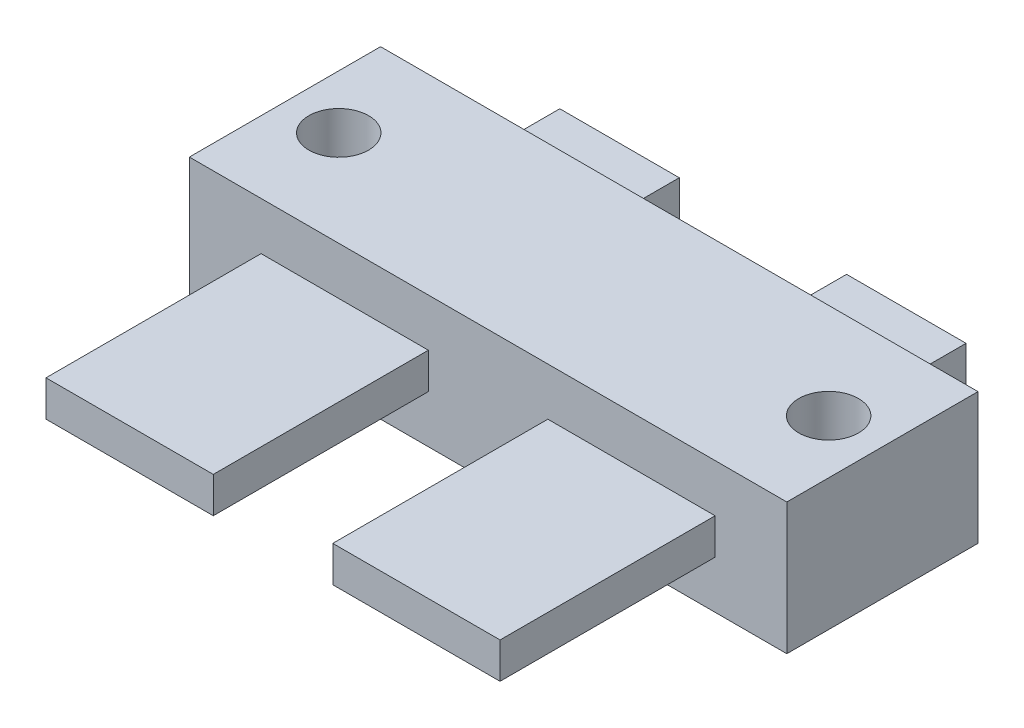
ISO-10303-21;
HEADER;
FILE_DESCRIPTION(('STEP AP214'),'2;1');
FILE_NAME('part.step','',(''),(''),'','','');
FILE_SCHEMA(('AUTOMOTIVE_DESIGN { 1 0 10303 214 1 1 1 1 }'));
ENDSEC;
DATA;
#1=APPLICATION_CONTEXT('core data for automotive mechanical design processes');
#2=APPLICATION_PROTOCOL_DEFINITION('international standard','automotive_design',2000,#1);
#3=PRODUCT_CONTEXT('',#1,'mechanical');
#4=PRODUCT('Part','Part','',(#3));
#5=PRODUCT_RELATED_PRODUCT_CATEGORY('part','',(#4));
#6=PRODUCT_DEFINITION_FORMATION('','',#4);
#7=PRODUCT_DEFINITION_CONTEXT('part definition',#1,'design');
#8=PRODUCT_DEFINITION('design','',#6,#7);
#9=PRODUCT_DEFINITION_SHAPE('','',#8);
#10=(LENGTH_UNIT() NAMED_UNIT(*) SI_UNIT(.MILLI.,.METRE.));
#11=(NAMED_UNIT(*) PLANE_ANGLE_UNIT() SI_UNIT($,.RADIAN.));
#12=(NAMED_UNIT(*) SI_UNIT($,.STERADIAN.) SOLID_ANGLE_UNIT());
#13=UNCERTAINTY_MEASURE_WITH_UNIT(LENGTH_MEASURE(1.E-05),#10,'distance_accuracy_value','');
#14=(GEOMETRIC_REPRESENTATION_CONTEXT(3) GLOBAL_UNCERTAINTY_ASSIGNED_CONTEXT((#13)) GLOBAL_UNIT_ASSIGNED_CONTEXT((#10,
#11,#12)) REPRESENTATION_CONTEXT('',''));
#15=CARTESIAN_POINT('',(0.,0.,0.));
#16=DIRECTION('',(0.,0.,1.));
#17=DIRECTION('',(1.,0.,0.));
#18=AXIS2_PLACEMENT_3D('',#15,#16,#17);
#19=CARTESIAN_POINT('',(-12.5,5.5,-4.));
#20=DIRECTION('',(0.,0.,1.));
#21=DIRECTION('',(1.,0.,0.));
#22=AXIS2_PLACEMENT_3D('',#19,#20,#21);
#23=PLANE('',#22);
#24=DIRECTION('',(0.,1.,0.));
#25=VECTOR('',#24,1.);
#26=CARTESIAN_POINT('',(3.50000000000001,3.5,-4.));
#27=LINE('',#26,#25);
#28=CARTESIAN_POINT('',(3.5,2.,-4.));
#29=VERTEX_POINT('',#28);
#30=CARTESIAN_POINT('',(3.50000000000001,3.5,-4.));
#31=VERTEX_POINT('',#30);
#32=EDGE_CURVE('E197',#29,#31,#27,.T.);
#33=ORIENTED_EDGE('',*,*,#32,.F.);
#34=DIRECTION('',(-1.,0.,0.));
#35=VECTOR('',#34,1.);
#36=CARTESIAN_POINT('',(8.50000000000001,2.,-4.));
#37=LINE('',#36,#35);
#38=CARTESIAN_POINT('',(8.5,2.,-4.));
#39=VERTEX_POINT('',#38);
#40=EDGE_CURVE('E209',#39,#29,#37,.T.);
#41=ORIENTED_EDGE('',*,*,#40,.F.);
#42=DIRECTION('',(0.,-1.,0.));
#43=VECTOR('',#42,1.);
#44=CARTESIAN_POINT('',(8.50000000000001,3.5,-4.));
#45=LINE('',#44,#43);
#46=CARTESIAN_POINT('',(8.50000000000001,3.5,-4.));
#47=VERTEX_POINT('',#46);
#48=EDGE_CURVE('E218',#47,#39,#45,.T.);
#49=ORIENTED_EDGE('',*,*,#48,.F.);
#50=DIRECTION('',(1.,0.,0.));
#51=VECTOR('',#50,1.);
#52=CARTESIAN_POINT('',(8.50000000000001,3.5,-4.));
#53=LINE('',#52,#51);
#54=EDGE_CURVE('E199',#31,#47,#53,.T.);
#55=ORIENTED_EDGE('',*,*,#54,.F.);
#56=EDGE_LOOP('',(#33,#41,#49,#55));
#57=FACE_BOUND('',#56,.T.);
#58=DIRECTION('',(-1.,0.,0.));
#59=VECTOR('',#58,1.);
#60=CARTESIAN_POINT('',(-12.5,0.,-4.));
#61=LINE('',#60,#59);
#62=CARTESIAN_POINT('',(12.5,0.,-4.));
#63=VERTEX_POINT('',#62);
#64=CARTESIAN_POINT('',(-12.5,0.,-4.));
#65=VERTEX_POINT('',#64);
#66=EDGE_CURVE('E312',#63,#65,#61,.T.);
#67=ORIENTED_EDGE('',*,*,#66,.T.);
#68=DIRECTION('',(0.,-1.,0.));
#69=VECTOR('',#68,1.);
#70=CARTESIAN_POINT('',(-12.5,5.5,-4.));
#71=LINE('',#70,#69);
#72=CARTESIAN_POINT('',(-12.5,5.5,-4.));
#73=VERTEX_POINT('',#72);
#74=EDGE_CURVE('E50',#73,#65,#71,.T.);
#75=ORIENTED_EDGE('',*,*,#74,.F.);
#76=DIRECTION('',(-1.,0.,0.));
#77=VECTOR('',#76,1.);
#78=CARTESIAN_POINT('',(-12.5,5.5,-4.));
#79=LINE('',#78,#77);
#80=CARTESIAN_POINT('',(12.5,5.5,-4.));
#81=VERTEX_POINT('',#80);
#82=EDGE_CURVE('E303',#81,#73,#79,.T.);
#83=ORIENTED_EDGE('',*,*,#82,.F.);
#84=DIRECTION('',(0.,-1.,0.));
#85=VECTOR('',#84,1.);
#86=CARTESIAN_POINT('',(12.5,5.5,-4.));
#87=LINE('',#86,#85);
#88=EDGE_CURVE('E11',#81,#63,#87,.T.);
#89=ORIENTED_EDGE('',*,*,#88,.T.);
#90=EDGE_LOOP('',(#67,#75,#83,#89));
#91=FACE_BOUND('',#90,.T.);
#92=DIRECTION('',(0.,1.,0.));
#93=VECTOR('',#92,1.);
#94=CARTESIAN_POINT('',(-8.49999999999998,3.5,-4.));
#95=LINE('',#94,#93);
#96=CARTESIAN_POINT('',(-8.49999999999999,2.,-4.));
#97=VERTEX_POINT('',#96);
#98=CARTESIAN_POINT('',(-8.49999999999998,3.5,-4.));
#99=VERTEX_POINT('',#98);
#100=EDGE_CURVE('E198',#97,#99,#95,.T.);
#101=ORIENTED_EDGE('',*,*,#100,.F.);
#102=DIRECTION('',(-1.,0.,0.));
#103=VECTOR('',#102,1.);
#104=CARTESIAN_POINT('',(-8.49999999999999,2.,-4.));
#105=LINE('',#104,#103);
#106=CARTESIAN_POINT('',(-3.49999999999999,2.,-4.));
#107=VERTEX_POINT('',#106);
#108=EDGE_CURVE('E194',#107,#97,#105,.T.);
#109=ORIENTED_EDGE('',*,*,#108,.F.);
#110=DIRECTION('',(0.,-1.,0.));
#111=VECTOR('',#110,1.);
#112=CARTESIAN_POINT('',(-3.49999999999998,3.5,-4.));
#113=LINE('',#112,#111);
#114=CARTESIAN_POINT('',(-3.49999999999998,3.5,-4.));
#115=VERTEX_POINT('',#114);
#116=EDGE_CURVE('E56',#115,#107,#113,.T.);
#117=ORIENTED_EDGE('',*,*,#116,.F.);
#118=DIRECTION('',(1.,0.,0.));
#119=VECTOR('',#118,1.);
#120=CARTESIAN_POINT('',(-8.49999999999998,3.5,-4.));
#121=LINE('',#120,#119);
#122=EDGE_CURVE('E53',#99,#115,#121,.T.);
#123=ORIENTED_EDGE('',*,*,#122,.F.);
#124=EDGE_LOOP('',(#101,#109,#117,#123));
#125=FACE_BOUND('',#124,.T.);
#126=ADVANCED_FACE('F39',(#57,#91,#125),#23,.F.);
#127=CARTESIAN_POINT('',(-12.5,5.5,4.));
#128=DIRECTION('',(0.,0.,-1.));
#129=DIRECTION('',(-1.,0.,0.));
#130=AXIS2_PLACEMENT_3D('',#127,#128,#129);
#131=PLANE('',#130);
#132=DIRECTION('',(0.,1.,0.));
#133=VECTOR('',#132,1.);
#134=CARTESIAN_POINT('',(-2.49999999999999,3.5,4.));
#135=LINE('',#134,#133);
#136=CARTESIAN_POINT('',(-2.49999999999999,2.,4.));
#137=VERTEX_POINT('',#136);
#138=CARTESIAN_POINT('',(-2.49999999999999,3.5,4.));
#139=VERTEX_POINT('',#138);
#140=EDGE_CURVE('E268',#137,#139,#135,.T.);
#141=ORIENTED_EDGE('',*,*,#140,.F.);
#142=DIRECTION('',(1.,0.,0.));
#143=VECTOR('',#142,1.);
#144=CARTESIAN_POINT('',(-9.49999999999999,2.,4.));
#145=LINE('',#144,#143);
#146=CARTESIAN_POINT('',(-9.49999999999999,2.,4.));
#147=VERTEX_POINT('',#146);
#148=EDGE_CURVE('E272',#147,#137,#145,.T.);
#149=ORIENTED_EDGE('',*,*,#148,.F.);
#150=DIRECTION('',(0.,-1.,0.));
#151=VECTOR('',#150,1.);
#152=CARTESIAN_POINT('',(-9.49999999999999,3.5,4.));
#153=LINE('',#152,#151);
#154=CARTESIAN_POINT('',(-9.49999999999999,3.5,4.));
#155=VERTEX_POINT('',#154);
#156=EDGE_CURVE('E285',#155,#147,#153,.T.);
#157=ORIENTED_EDGE('',*,*,#156,.F.);
#158=DIRECTION('',(-1.,0.,0.));
#159=VECTOR('',#158,1.);
#160=CARTESIAN_POINT('',(-9.49999999999999,3.5,4.));
#161=LINE('',#160,#159);
#162=EDGE_CURVE('E282',#139,#155,#161,.T.);
#163=ORIENTED_EDGE('',*,*,#162,.F.);
#164=EDGE_LOOP('',(#141,#149,#157,#163));
#165=FACE_BOUND('',#164,.T.);
#166=DIRECTION('',(1.,0.,0.));
#167=VECTOR('',#166,1.);
#168=CARTESIAN_POINT('',(-12.5,0.,4.));
#169=LINE('',#168,#167);
#170=CARTESIAN_POINT('',(-12.5,0.,4.));
#171=VERTEX_POINT('',#170);
#172=CARTESIAN_POINT('',(12.5,0.,4.));
#173=VERTEX_POINT('',#172);
#174=EDGE_CURVE('E308',#171,#173,#169,.T.);
#175=ORIENTED_EDGE('',*,*,#174,.T.);
#176=DIRECTION('',(0.,-1.,0.));
#177=VECTOR('',#176,1.);
#178=CARTESIAN_POINT('',(12.5,5.5,4.));
#179=LINE('',#178,#177);
#180=CARTESIAN_POINT('',(12.5,5.5,4.));
#181=VERTEX_POINT('',#180);
#182=EDGE_CURVE('E315',#181,#173,#179,.T.);
#183=ORIENTED_EDGE('',*,*,#182,.F.);
#184=DIRECTION('',(1.,0.,0.));
#185=VECTOR('',#184,1.);
#186=CARTESIAN_POINT('',(-12.5,5.5,4.));
#187=LINE('',#186,#185);
#188=CARTESIAN_POINT('',(-12.5,5.5,4.));
#189=VERTEX_POINT('',#188);
#190=EDGE_CURVE('E309',#189,#181,#187,.T.);
#191=ORIENTED_EDGE('',*,*,#190,.F.);
#192=DIRECTION('',(0.,-1.,0.));
#193=VECTOR('',#192,1.);
#194=CARTESIAN_POINT('',(-12.5,5.5,4.));
#195=LINE('',#194,#193);
#196=EDGE_CURVE('E325',#189,#171,#195,.T.);
#197=ORIENTED_EDGE('',*,*,#196,.T.);
#198=EDGE_LOOP('',(#175,#183,#191,#197));
#199=FACE_BOUND('',#198,.T.);
#200=DIRECTION('',(0.,1.,0.));
#201=VECTOR('',#200,1.);
#202=CARTESIAN_POINT('',(9.49999999999997,3.5,4.));
#203=LINE('',#202,#201);
#204=CARTESIAN_POINT('',(9.49999999999998,2.,4.));
#205=VERTEX_POINT('',#204);
#206=CARTESIAN_POINT('',(9.49999999999997,3.5,4.));
#207=VERTEX_POINT('',#206);
#208=EDGE_CURVE('E233',#205,#207,#203,.T.);
#209=ORIENTED_EDGE('',*,*,#208,.F.);
#210=DIRECTION('',(1.,0.,0.));
#211=VECTOR('',#210,1.);
#212=CARTESIAN_POINT('',(9.49999999999998,2.,4.));
#213=LINE('',#212,#211);
#214=CARTESIAN_POINT('',(2.49999999999998,2.,4.));
#215=VERTEX_POINT('',#214);
#216=EDGE_CURVE('E238',#215,#205,#213,.T.);
#217=ORIENTED_EDGE('',*,*,#216,.F.);
#218=DIRECTION('',(0.,-1.,0.));
#219=VECTOR('',#218,1.);
#220=CARTESIAN_POINT('',(2.49999999999997,3.5,4.));
#221=LINE('',#220,#219);
#222=CARTESIAN_POINT('',(2.49999999999997,3.5,4.));
#223=VERTEX_POINT('',#222);
#224=EDGE_CURVE('E252',#223,#215,#221,.T.);
#225=ORIENTED_EDGE('',*,*,#224,.F.);
#226=DIRECTION('',(-1.,0.,0.));
#227=VECTOR('',#226,1.);
#228=CARTESIAN_POINT('',(9.49999999999997,3.5,4.));
#229=LINE('',#228,#227);
#230=EDGE_CURVE('E246',#207,#223,#229,.T.);
#231=ORIENTED_EDGE('',*,*,#230,.F.);
#232=EDGE_LOOP('',(#209,#217,#225,#231));
#233=FACE_BOUND('',#232,.T.);
#234=ADVANCED_FACE('F339',(#165,#199,#233),#131,.F.);
#235=CARTESIAN_POINT('',(12.5,5.5,4.));
#236=DIRECTION('',(-1.,0.,0.));
#237=DIRECTION('',(0.,0.,1.));
#238=AXIS2_PLACEMENT_3D('',#235,#236,#237);
#239=PLANE('',#238);
#240=DIRECTION('',(0.,0.,-1.));
#241=VECTOR('',#240,1.);
#242=CARTESIAN_POINT('',(12.5,0.,4.));
#243=LINE('',#242,#241);
#244=EDGE_CURVE('E302',#173,#63,#243,.T.);
#245=ORIENTED_EDGE('',*,*,#244,.T.);
#246=ORIENTED_EDGE('',*,*,#88,.F.);
#247=DIRECTION('',(0.,0.,-1.));
#248=VECTOR('',#247,1.);
#249=CARTESIAN_POINT('',(12.5,5.5,4.));
#250=LINE('',#249,#248);
#251=EDGE_CURVE('E305',#181,#81,#250,.T.);
#252=ORIENTED_EDGE('',*,*,#251,.F.);
#253=ORIENTED_EDGE('',*,*,#182,.T.);
#254=EDGE_LOOP('',(#245,#246,#252,#253));
#255=FACE_BOUND('',#254,.T.);
#256=ADVANCED_FACE('F41',(#255),#239,.F.);
#257=CARTESIAN_POINT('',(-12.5,5.5,4.));
#258=DIRECTION('',(1.,0.,0.));
#259=DIRECTION('',(0.,0.,-1.));
#260=AXIS2_PLACEMENT_3D('',#257,#258,#259);
#261=PLANE('',#260);
#262=DIRECTION('',(0.,0.,1.));
#263=VECTOR('',#262,1.);
#264=CARTESIAN_POINT('',(-12.5,0.,4.));
#265=LINE('',#264,#263);
#266=EDGE_CURVE('E320',#65,#171,#265,.T.);
#267=ORIENTED_EDGE('',*,*,#266,.T.);
#268=ORIENTED_EDGE('',*,*,#196,.F.);
#269=DIRECTION('',(0.,0.,1.));
#270=VECTOR('',#269,1.);
#271=CARTESIAN_POINT('',(-12.5,5.5,4.));
#272=LINE('',#271,#270);
#273=EDGE_CURVE('E306',#73,#189,#272,.T.);
#274=ORIENTED_EDGE('',*,*,#273,.F.);
#275=ORIENTED_EDGE('',*,*,#74,.T.);
#276=EDGE_LOOP('',(#267,#268,#274,#275));
#277=FACE_BOUND('',#276,.T.);
#278=ADVANCED_FACE('F328',(#277),#261,.F.);
#279=CARTESIAN_POINT('',(0.,5.5,0.));
#280=DIRECTION('',(0.,-1.,0.));
#281=DIRECTION('',(0.,0.,-1.));
#282=AXIS2_PLACEMENT_3D('',#279,#280,#281);
#283=PLANE('',#282);
#284=CARTESIAN_POINT('',(-10.25,5.5,0.));
#285=DIRECTION('',(0.,1.,0.));
#286=DIRECTION('',(0.,0.,1.));
#287=AXIS2_PLACEMENT_3D('',#284,#285,#286);
#288=CIRCLE('',#287,1.25);
#289=CARTESIAN_POINT('',(-10.25,5.5,1.25));
#290=VERTEX_POINT('',#289);
#291=EDGE_CURVE('E369',#290,#290,#288,.T.);
#292=ORIENTED_EDGE('',*,*,#291,.F.);
#293=EDGE_LOOP('',(#292));
#294=FACE_BOUND('',#293,.T.);
#295=CARTESIAN_POINT('',(10.25,5.5,0.));
#296=DIRECTION('',(0.,1.,0.));
#297=DIRECTION('',(0.,0.,-1.));
#298=AXIS2_PLACEMENT_3D('',#295,#296,#297);
#299=CIRCLE('',#298,1.25);
#300=CARTESIAN_POINT('',(10.25,5.5,-1.25));
#301=VERTEX_POINT('',#300);
#302=EDGE_CURVE('E361',#301,#301,#299,.T.);
#303=ORIENTED_EDGE('',*,*,#302,.F.);
#304=EDGE_LOOP('',(#303));
#305=FACE_BOUND('',#304,.T.);
#306=ORIENTED_EDGE('',*,*,#251,.T.);
#307=ORIENTED_EDGE('',*,*,#82,.T.);
#308=ORIENTED_EDGE('',*,*,#273,.T.);
#309=ORIENTED_EDGE('',*,*,#190,.T.);
#310=EDGE_LOOP('',(#306,#307,#308,#309));
#311=FACE_BOUND('',#310,.T.);
#312=ADVANCED_FACE('F343',(#294,#305,#311),#283,.F.);
#313=CARTESIAN_POINT('',(0.,0.,0.));
#314=DIRECTION('',(0.,-1.,0.));
#315=DIRECTION('',(0.,0.,-1.));
#316=AXIS2_PLACEMENT_3D('',#313,#314,#315);
#317=PLANE('',#316);
#318=ORIENTED_EDGE('',*,*,#244,.F.);
#319=ORIENTED_EDGE('',*,*,#174,.F.);
#320=ORIENTED_EDGE('',*,*,#266,.F.);
#321=ORIENTED_EDGE('',*,*,#66,.F.);
#322=EDGE_LOOP('',(#318,#319,#320,#321));
#323=FACE_BOUND('',#322,.T.);
#324=ADVANCED_FACE('F333',(#323),#317,.T.);
#325=CARTESIAN_POINT('',(-2.49999999999999,3.5,13.));
#326=DIRECTION('',(-1.,0.,0.));
#327=DIRECTION('',(0.,-1.,0.));
#328=AXIS2_PLACEMENT_3D('',#325,#326,#327);
#329=PLANE('',#328);
#330=ORIENTED_EDGE('',*,*,#140,.T.);
#331=DIRECTION('',(0.,0.,-1.));
#332=VECTOR('',#331,1.);
#333=CARTESIAN_POINT('',(-2.49999999999999,3.5,13.));
#334=LINE('',#333,#332);
#335=CARTESIAN_POINT('',(-2.49999999999999,3.5,13.));
#336=VERTEX_POINT('',#335);
#337=EDGE_CURVE('E299',#336,#139,#334,.T.);
#338=ORIENTED_EDGE('',*,*,#337,.F.);
#339=DIRECTION('',(0.,1.,0.));
#340=VECTOR('',#339,1.);
#341=CARTESIAN_POINT('',(-2.49999999999999,3.5,13.));
#342=LINE('',#341,#340);
#343=CARTESIAN_POINT('',(-2.49999999999999,2.,13.));
#344=VERTEX_POINT('',#343);
#345=EDGE_CURVE('E267',#344,#336,#342,.T.);
#346=ORIENTED_EDGE('',*,*,#345,.F.);
#347=DIRECTION('',(0.,0.,-1.));
#348=VECTOR('',#347,1.);
#349=CARTESIAN_POINT('',(-2.49999999999999,2.,13.));
#350=LINE('',#349,#348);
#351=EDGE_CURVE('E276',#344,#137,#350,.T.);
#352=ORIENTED_EDGE('',*,*,#351,.T.);
#353=EDGE_LOOP('',(#330,#338,#346,#352));
#354=FACE_BOUND('',#353,.T.);
#355=ADVANCED_FACE('F470',(#354),#329,.F.);
#356=CARTESIAN_POINT('',(-9.49999999999999,3.5,13.));
#357=DIRECTION('',(0.,-1.,0.));
#358=DIRECTION('',(0.,0.,-1.));
#359=AXIS2_PLACEMENT_3D('',#356,#357,#358);
#360=PLANE('',#359);
#361=ORIENTED_EDGE('',*,*,#162,.T.);
#362=DIRECTION('',(0.,0.,-1.));
#363=VECTOR('',#362,1.);
#364=CARTESIAN_POINT('',(-9.49999999999999,3.5,13.));
#365=LINE('',#364,#363);
#366=CARTESIAN_POINT('',(-9.49999999999999,3.5,13.));
#367=VERTEX_POINT('',#366);
#368=EDGE_CURVE('E293',#367,#155,#365,.T.);
#369=ORIENTED_EDGE('',*,*,#368,.F.);
#370=DIRECTION('',(-1.,0.,0.));
#371=VECTOR('',#370,1.);
#372=CARTESIAN_POINT('',(-9.49999999999999,3.5,13.));
#373=LINE('',#372,#371);
#374=EDGE_CURVE('E275',#336,#367,#373,.T.);
#375=ORIENTED_EDGE('',*,*,#374,.F.);
#376=ORIENTED_EDGE('',*,*,#337,.T.);
#377=EDGE_LOOP('',(#361,#369,#375,#376));
#378=FACE_BOUND('',#377,.T.);
#379=ADVANCED_FACE('F464',(#378),#360,.F.);
#380=CARTESIAN_POINT('',(-9.49999999999999,3.5,13.));
#381=DIRECTION('',(1.,0.,0.));
#382=DIRECTION('',(0.,0.,-1.));
#383=AXIS2_PLACEMENT_3D('',#380,#381,#382);
#384=PLANE('',#383);
#385=ORIENTED_EDGE('',*,*,#156,.T.);
#386=DIRECTION('',(0.,0.,-1.));
#387=VECTOR('',#386,1.);
#388=CARTESIAN_POINT('',(-9.49999999999999,2.,13.));
#389=LINE('',#388,#387);
#390=CARTESIAN_POINT('',(-9.49999999999999,2.,13.));
#391=VERTEX_POINT('',#390);
#392=EDGE_CURVE('E295',#391,#147,#389,.T.);
#393=ORIENTED_EDGE('',*,*,#392,.F.);
#394=DIRECTION('',(0.,-1.,0.));
#395=VECTOR('',#394,1.);
#396=CARTESIAN_POINT('',(-9.49999999999999,3.5,13.));
#397=LINE('',#396,#395);
#398=EDGE_CURVE('E274',#367,#391,#397,.T.);
#399=ORIENTED_EDGE('',*,*,#398,.F.);
#400=ORIENTED_EDGE('',*,*,#368,.T.);
#401=EDGE_LOOP('',(#385,#393,#399,#400));
#402=FACE_BOUND('',#401,.T.);
#403=ADVANCED_FACE('F459',(#402),#384,.F.);
#404=CARTESIAN_POINT('',(-9.49999999999999,2.,13.));
#405=DIRECTION('',(0.,1.,0.));
#406=DIRECTION('',(0.,0.,1.));
#407=AXIS2_PLACEMENT_3D('',#404,#405,#406);
#408=PLANE('',#407);
#409=ORIENTED_EDGE('',*,*,#148,.T.);
#410=ORIENTED_EDGE('',*,*,#351,.F.);
#411=DIRECTION('',(1.,0.,0.));
#412=VECTOR('',#411,1.);
#413=CARTESIAN_POINT('',(-9.49999999999999,2.,13.));
#414=LINE('',#413,#412);
#415=EDGE_CURVE('E280',#391,#344,#414,.T.);
#416=ORIENTED_EDGE('',*,*,#415,.F.);
#417=ORIENTED_EDGE('',*,*,#392,.T.);
#418=EDGE_LOOP('',(#409,#410,#416,#417));
#419=FACE_BOUND('',#418,.T.);
#420=ADVANCED_FACE('F453',(#419),#408,.F.);
#421=CARTESIAN_POINT('',(0.,0.,13.));
#422=DIRECTION('',(0.,0.,1.));
#423=DIRECTION('',(1.,0.,0.));
#424=AXIS2_PLACEMENT_3D('',#421,#422,#423);
#425=PLANE('',#424);
#426=ORIENTED_EDGE('',*,*,#345,.T.);
#427=ORIENTED_EDGE('',*,*,#374,.T.);
#428=ORIENTED_EDGE('',*,*,#398,.T.);
#429=ORIENTED_EDGE('',*,*,#415,.T.);
#430=EDGE_LOOP('',(#426,#427,#428,#429));
#431=FACE_BOUND('',#430,.T.);
#432=ADVANCED_FACE('F452',(#431),#425,.T.);
#433=CARTESIAN_POINT('',(9.49999999999997,3.5,13.));
#434=DIRECTION('',(-1.,0.,0.));
#435=DIRECTION('',(0.,-1.,0.));
#436=AXIS2_PLACEMENT_3D('',#433,#434,#435);
#437=PLANE('',#436);
#438=ORIENTED_EDGE('',*,*,#208,.T.);
#439=DIRECTION('',(0.,0.,-1.));
#440=VECTOR('',#439,1.);
#441=CARTESIAN_POINT('',(9.49999999999997,3.5,13.));
#442=LINE('',#441,#440);
#443=CARTESIAN_POINT('',(9.49999999999997,3.5,13.));
#444=VERTEX_POINT('',#443);
#445=EDGE_CURVE('E264',#444,#207,#442,.T.);
#446=ORIENTED_EDGE('',*,*,#445,.F.);
#447=DIRECTION('',(0.,1.,0.));
#448=VECTOR('',#447,1.);
#449=CARTESIAN_POINT('',(9.49999999999997,3.5,13.));
#450=LINE('',#449,#448);
#451=CARTESIAN_POINT('',(9.49999999999998,2.,13.));
#452=VERTEX_POINT('',#451);
#453=EDGE_CURVE('E237',#452,#444,#450,.T.);
#454=ORIENTED_EDGE('',*,*,#453,.F.);
#455=DIRECTION('',(0.,0.,-1.));
#456=VECTOR('',#455,1.);
#457=CARTESIAN_POINT('',(9.49999999999998,2.,13.));
#458=LINE('',#457,#456);
#459=EDGE_CURVE('E247',#452,#205,#458,.T.);
#460=ORIENTED_EDGE('',*,*,#459,.T.);
#461=EDGE_LOOP('',(#438,#446,#454,#460));
#462=FACE_BOUND('',#461,.T.);
#463=ADVANCED_FACE('F447',(#462),#437,.F.);
#464=CARTESIAN_POINT('',(9.49999999999997,3.5,13.));
#465=DIRECTION('',(0.,-1.,0.));
#466=DIRECTION('',(0.,0.,-1.));
#467=AXIS2_PLACEMENT_3D('',#464,#465,#466);
#468=PLANE('',#467);
#469=ORIENTED_EDGE('',*,*,#230,.T.);
#470=DIRECTION('',(0.,0.,-1.));
#471=VECTOR('',#470,1.);
#472=CARTESIAN_POINT('',(2.49999999999997,3.5,13.));
#473=LINE('',#472,#471);
#474=CARTESIAN_POINT('',(2.49999999999997,3.5,13.));
#475=VERTEX_POINT('',#474);
#476=EDGE_CURVE('E265',#475,#223,#473,.T.);
#477=ORIENTED_EDGE('',*,*,#476,.F.);
#478=DIRECTION('',(-1.,0.,0.));
#479=VECTOR('',#478,1.);
#480=CARTESIAN_POINT('',(9.49999999999997,3.5,13.));
#481=LINE('',#480,#479);
#482=EDGE_CURVE('E239',#444,#475,#481,.T.);
#483=ORIENTED_EDGE('',*,*,#482,.F.);
#484=ORIENTED_EDGE('',*,*,#445,.T.);
#485=EDGE_LOOP('',(#469,#477,#483,#484));
#486=FACE_BOUND('',#485,.T.);
#487=ADVANCED_FACE('F444',(#486),#468,.F.);
#488=CARTESIAN_POINT('',(2.49999999999997,3.5,13.));
#489=DIRECTION('',(1.,0.,0.));
#490=DIRECTION('',(0.,1.,0.));
#491=AXIS2_PLACEMENT_3D('',#488,#489,#490);
#492=PLANE('',#491);
#493=ORIENTED_EDGE('',*,*,#224,.T.);
#494=DIRECTION('',(0.,0.,-1.));
#495=VECTOR('',#494,1.);
#496=CARTESIAN_POINT('',(2.49999999999998,2.,13.));
#497=LINE('',#496,#495);
#498=CARTESIAN_POINT('',(2.49999999999998,2.,13.));
#499=VERTEX_POINT('',#498);
#500=EDGE_CURVE('E259',#499,#215,#497,.T.);
#501=ORIENTED_EDGE('',*,*,#500,.F.);
#502=DIRECTION('',(0.,-1.,0.));
#503=VECTOR('',#502,1.);
#504=CARTESIAN_POINT('',(2.49999999999997,3.5,13.));
#505=LINE('',#504,#503);
#506=EDGE_CURVE('E242',#475,#499,#505,.T.);
#507=ORIENTED_EDGE('',*,*,#506,.F.);
#508=ORIENTED_EDGE('',*,*,#476,.T.);
#509=EDGE_LOOP('',(#493,#501,#507,#508));
#510=FACE_BOUND('',#509,.T.);
#511=ADVANCED_FACE('F438',(#510),#492,.F.);
#512=CARTESIAN_POINT('',(9.49999999999998,2.,13.));
#513=DIRECTION('',(0.,1.,0.));
#514=DIRECTION('',(0.,0.,1.));
#515=AXIS2_PLACEMENT_3D('',#512,#513,#514);
#516=PLANE('',#515);
#517=ORIENTED_EDGE('',*,*,#216,.T.);
#518=ORIENTED_EDGE('',*,*,#459,.F.);
#519=DIRECTION('',(1.,0.,0.));
#520=VECTOR('',#519,1.);
#521=CARTESIAN_POINT('',(9.49999999999998,2.,13.));
#522=LINE('',#521,#520);
#523=EDGE_CURVE('E243',#499,#452,#522,.T.);
#524=ORIENTED_EDGE('',*,*,#523,.F.);
#525=ORIENTED_EDGE('',*,*,#500,.T.);
#526=EDGE_LOOP('',(#517,#518,#524,#525));
#527=FACE_BOUND('',#526,.T.);
#528=ADVANCED_FACE('F434',(#527),#516,.F.);
#529=CARTESIAN_POINT('',(0.,0.,13.));
#530=DIRECTION('',(0.,0.,-1.));
#531=DIRECTION('',(-1.,0.,0.));
#532=AXIS2_PLACEMENT_3D('',#529,#530,#531);
#533=PLANE('',#532);
#534=ORIENTED_EDGE('',*,*,#453,.T.);
#535=ORIENTED_EDGE('',*,*,#482,.T.);
#536=ORIENTED_EDGE('',*,*,#506,.T.);
#537=ORIENTED_EDGE('',*,*,#523,.T.);
#538=EDGE_LOOP('',(#534,#535,#536,#537));
#539=FACE_BOUND('',#538,.T.);
#540=ADVANCED_FACE('F431',(#539),#533,.F.);
#541=CARTESIAN_POINT('',(3.50000000000001,3.5,-7.5));
#542=DIRECTION('',(1.,0.,0.));
#543=DIRECTION('',(0.,1.,0.));
#544=AXIS2_PLACEMENT_3D('',#541,#542,#543);
#545=PLANE('',#544);
#546=ORIENTED_EDGE('',*,*,#32,.T.);
#547=DIRECTION('',(0.,0.,1.));
#548=VECTOR('',#547,1.);
#549=CARTESIAN_POINT('',(3.50000000000001,3.5,-7.5));
#550=LINE('',#549,#548);
#551=CARTESIAN_POINT('',(3.50000000000001,3.5,-7.5));
#552=VERTEX_POINT('',#551);
#553=EDGE_CURVE('E235',#552,#31,#550,.T.);
#554=ORIENTED_EDGE('',*,*,#553,.F.);
#555=DIRECTION('',(0.,1.,0.));
#556=VECTOR('',#555,1.);
#557=CARTESIAN_POINT('',(3.50000000000001,3.5,-7.5));
#558=LINE('',#557,#556);
#559=CARTESIAN_POINT('',(3.5,2.,-7.5));
#560=VERTEX_POINT('',#559);
#561=EDGE_CURVE('E206',#560,#552,#558,.T.);
#562=ORIENTED_EDGE('',*,*,#561,.F.);
#563=DIRECTION('',(0.,0.,1.));
#564=VECTOR('',#563,1.);
#565=CARTESIAN_POINT('',(3.5,2.,-7.5));
#566=LINE('',#565,#564);
#567=EDGE_CURVE('E214',#560,#29,#566,.T.);
#568=ORIENTED_EDGE('',*,*,#567,.T.);
#569=EDGE_LOOP('',(#546,#554,#562,#568));
#570=FACE_BOUND('',#569,.T.);
#571=ADVANCED_FACE('F430',(#570),#545,.F.);
#572=CARTESIAN_POINT('',(8.50000000000001,3.5,-7.5));
#573=DIRECTION('',(0.,-1.,0.));
#574=DIRECTION('',(0.,0.,-1.));
#575=AXIS2_PLACEMENT_3D('',#572,#573,#574);
#576=PLANE('',#575);
#577=ORIENTED_EDGE('',*,*,#54,.T.);
#578=DIRECTION('',(0.,0.,1.));
#579=VECTOR('',#578,1.);
#580=CARTESIAN_POINT('',(8.50000000000001,3.5,-7.5));
#581=LINE('',#580,#579);
#582=CARTESIAN_POINT('',(8.50000000000001,3.5,-7.5));
#583=VERTEX_POINT('',#582);
#584=EDGE_CURVE('E228',#583,#47,#581,.T.);
#585=ORIENTED_EDGE('',*,*,#584,.F.);
#586=DIRECTION('',(1.,0.,0.));
#587=VECTOR('',#586,1.);
#588=CARTESIAN_POINT('',(8.50000000000001,3.5,-7.5));
#589=LINE('',#588,#587);
#590=EDGE_CURVE('E207',#552,#583,#589,.T.);
#591=ORIENTED_EDGE('',*,*,#590,.F.);
#592=ORIENTED_EDGE('',*,*,#553,.T.);
#593=EDGE_LOOP('',(#577,#585,#591,#592));
#594=FACE_BOUND('',#593,.T.);
#595=ADVANCED_FACE('F421',(#594),#576,.F.);
#596=CARTESIAN_POINT('',(8.50000000000001,3.5,-7.5));
#597=DIRECTION('',(-1.,0.,0.));
#598=DIRECTION('',(0.,0.,1.));
#599=AXIS2_PLACEMENT_3D('',#596,#597,#598);
#600=PLANE('',#599);
#601=ORIENTED_EDGE('',*,*,#48,.T.);
#602=DIRECTION('',(0.,0.,1.));
#603=VECTOR('',#602,1.);
#604=CARTESIAN_POINT('',(8.50000000000001,2.,-7.5));
#605=LINE('',#604,#603);
#606=CARTESIAN_POINT('',(8.50000000000001,2.,-7.5));
#607=VERTEX_POINT('',#606);
#608=EDGE_CURVE('E226',#607,#39,#605,.T.);
#609=ORIENTED_EDGE('',*,*,#608,.F.);
#610=DIRECTION('',(0.,-1.,0.));
#611=VECTOR('',#610,1.);
#612=CARTESIAN_POINT('',(8.50000000000001,3.5,-7.5));
#613=LINE('',#612,#611);
#614=EDGE_CURVE('E215',#583,#607,#613,.T.);
#615=ORIENTED_EDGE('',*,*,#614,.F.);
#616=ORIENTED_EDGE('',*,*,#584,.T.);
#617=EDGE_LOOP('',(#601,#609,#615,#616));
#618=FACE_BOUND('',#617,.T.);
#619=ADVANCED_FACE('F420',(#618),#600,.F.);
#620=CARTESIAN_POINT('',(8.50000000000001,2.,-7.5));
#621=DIRECTION('',(0.,1.,0.));
#622=DIRECTION('',(0.,0.,1.));
#623=AXIS2_PLACEMENT_3D('',#620,#621,#622);
#624=PLANE('',#623);
#625=ORIENTED_EDGE('',*,*,#40,.T.);
#626=ORIENTED_EDGE('',*,*,#567,.F.);
#627=DIRECTION('',(-1.,0.,0.));
#628=VECTOR('',#627,1.);
#629=CARTESIAN_POINT('',(8.50000000000001,2.,-7.5));
#630=LINE('',#629,#628);
#631=EDGE_CURVE('E212',#607,#560,#630,.T.);
#632=ORIENTED_EDGE('',*,*,#631,.F.);
#633=ORIENTED_EDGE('',*,*,#608,.T.);
#634=EDGE_LOOP('',(#625,#626,#632,#633));
#635=FACE_BOUND('',#634,.T.);
#636=ADVANCED_FACE('F413',(#635),#624,.F.);
#637=CARTESIAN_POINT('',(0.,0.,-7.5));
#638=DIRECTION('',(0.,0.,-1.));
#639=DIRECTION('',(-1.,0.,0.));
#640=AXIS2_PLACEMENT_3D('',#637,#638,#639);
#641=PLANE('',#640);
#642=ORIENTED_EDGE('',*,*,#561,.T.);
#643=ORIENTED_EDGE('',*,*,#590,.T.);
#644=ORIENTED_EDGE('',*,*,#614,.T.);
#645=ORIENTED_EDGE('',*,*,#631,.T.);
#646=EDGE_LOOP('',(#642,#643,#644,#645));
#647=FACE_BOUND('',#646,.T.);
#648=ADVANCED_FACE('F415',(#647),#641,.T.);
#649=CARTESIAN_POINT('',(-8.49999999999998,3.5,-7.5));
#650=DIRECTION('',(1.,0.,0.));
#651=DIRECTION('',(0.,1.,0.));
#652=AXIS2_PLACEMENT_3D('',#649,#650,#651);
#653=PLANE('',#652);
#654=ORIENTED_EDGE('',*,*,#100,.T.);
#655=DIRECTION('',(0.,0.,1.));
#656=VECTOR('',#655,1.);
#657=CARTESIAN_POINT('',(-8.49999999999998,3.5,-7.5));
#658=LINE('',#657,#656);
#659=CARTESIAN_POINT('',(-8.49999999999998,3.5,-7.5));
#660=VERTEX_POINT('',#659);
#661=EDGE_CURVE('E180',#660,#99,#658,.T.);
#662=ORIENTED_EDGE('',*,*,#661,.F.);
#663=DIRECTION('',(0.,1.,0.));
#664=VECTOR('',#663,1.);
#665=CARTESIAN_POINT('',(-8.49999999999998,3.5,-7.5));
#666=LINE('',#665,#664);
#667=CARTESIAN_POINT('',(-8.49999999999999,2.,-7.5));
#668=VERTEX_POINT('',#667);
#669=EDGE_CURVE('E184',#668,#660,#666,.T.);
#670=ORIENTED_EDGE('',*,*,#669,.F.);
#671=DIRECTION('',(0.,0.,1.));
#672=VECTOR('',#671,1.);
#673=CARTESIAN_POINT('',(-8.49999999999999,2.,-7.5));
#674=LINE('',#673,#672);
#675=EDGE_CURVE('E353',#668,#97,#674,.T.);
#676=ORIENTED_EDGE('',*,*,#675,.T.);
#677=EDGE_LOOP('',(#654,#662,#670,#676));
#678=FACE_BOUND('',#677,.T.);
#679=ADVANCED_FACE('F193',(#678),#653,.F.);
#680=CARTESIAN_POINT('',(-8.49999999999998,3.5,-7.5));
#681=DIRECTION('',(0.,-1.,0.));
#682=DIRECTION('',(0.,0.,-1.));
#683=AXIS2_PLACEMENT_3D('',#680,#681,#682);
#684=PLANE('',#683);
#685=ORIENTED_EDGE('',*,*,#122,.T.);
#686=DIRECTION('',(0.,0.,1.));
#687=VECTOR('',#686,1.);
#688=CARTESIAN_POINT('',(-3.49999999999998,3.5,-7.5));
#689=LINE('',#688,#687);
#690=CARTESIAN_POINT('',(-3.49999999999998,3.5,-7.5));
#691=VERTEX_POINT('',#690);
#692=EDGE_CURVE('E178',#691,#115,#689,.T.);
#693=ORIENTED_EDGE('',*,*,#692,.F.);
#694=DIRECTION('',(1.,0.,0.));
#695=VECTOR('',#694,1.);
#696=CARTESIAN_POINT('',(-8.49999999999998,3.5,-7.5));
#697=LINE('',#696,#695);
#698=EDGE_CURVE('E174',#660,#691,#697,.T.);
#699=ORIENTED_EDGE('',*,*,#698,.F.);
#700=ORIENTED_EDGE('',*,*,#661,.T.);
#701=EDGE_LOOP('',(#685,#693,#699,#700));
#702=FACE_BOUND('',#701,.T.);
#703=ADVANCED_FACE('F175',(#702),#684,.F.);
#704=CARTESIAN_POINT('',(-3.49999999999998,3.5,-7.5));
#705=DIRECTION('',(-1.,0.,0.));
#706=DIRECTION('',(0.,-1.,0.));
#707=AXIS2_PLACEMENT_3D('',#704,#705,#706);
#708=PLANE('',#707);
#709=ORIENTED_EDGE('',*,*,#116,.T.);
#710=DIRECTION('',(0.,0.,1.));
#711=VECTOR('',#710,1.);
#712=CARTESIAN_POINT('',(-3.49999999999999,2.,-7.5));
#713=LINE('',#712,#711);
#714=CARTESIAN_POINT('',(-3.49999999999999,2.,-7.5));
#715=VERTEX_POINT('',#714);
#716=EDGE_CURVE('E205',#715,#107,#713,.T.);
#717=ORIENTED_EDGE('',*,*,#716,.F.);
#718=DIRECTION('',(0.,-1.,0.));
#719=VECTOR('',#718,1.);
#720=CARTESIAN_POINT('',(-3.49999999999998,3.5,-7.5));
#721=LINE('',#720,#719);
#722=EDGE_CURVE('E181',#691,#715,#721,.T.);
#723=ORIENTED_EDGE('',*,*,#722,.F.);
#724=ORIENTED_EDGE('',*,*,#692,.T.);
#725=EDGE_LOOP('',(#709,#717,#723,#724));
#726=FACE_BOUND('',#725,.T.);
#727=ADVANCED_FACE('F404',(#726),#708,.F.);
#728=CARTESIAN_POINT('',(-8.49999999999999,2.,-7.5));
#729=DIRECTION('',(0.,1.,0.));
#730=DIRECTION('',(0.,0.,1.));
#731=AXIS2_PLACEMENT_3D('',#728,#729,#730);
#732=PLANE('',#731);
#733=ORIENTED_EDGE('',*,*,#108,.T.);
#734=ORIENTED_EDGE('',*,*,#675,.F.);
#735=DIRECTION('',(-1.,0.,0.));
#736=VECTOR('',#735,1.);
#737=CARTESIAN_POINT('',(-8.49999999999999,2.,-7.5));
#738=LINE('',#737,#736);
#739=EDGE_CURVE('E188',#715,#668,#738,.T.);
#740=ORIENTED_EDGE('',*,*,#739,.F.);
#741=ORIENTED_EDGE('',*,*,#716,.T.);
#742=EDGE_LOOP('',(#733,#734,#740,#741));
#743=FACE_BOUND('',#742,.T.);
#744=ADVANCED_FACE('F354',(#743),#732,.F.);
#745=CARTESIAN_POINT('',(0.,0.,-7.5));
#746=DIRECTION('',(0.,0.,1.));
#747=DIRECTION('',(1.,0.,0.));
#748=AXIS2_PLACEMENT_3D('',#745,#746,#747);
#749=PLANE('',#748);
#750=ORIENTED_EDGE('',*,*,#669,.T.);
#751=ORIENTED_EDGE('',*,*,#698,.T.);
#752=ORIENTED_EDGE('',*,*,#722,.T.);
#753=ORIENTED_EDGE('',*,*,#739,.T.);
#754=EDGE_LOOP('',(#750,#751,#752,#753));
#755=FACE_BOUND('',#754,.T.);
#756=ADVANCED_FACE('F187',(#755),#749,.F.);
#757=CARTESIAN_POINT('',(10.25,3.5,0.));
#758=DIRECTION('',(0.,1.,0.));
#759=DIRECTION('',(0.,0.,1.));
#760=AXIS2_PLACEMENT_3D('',#757,#758,#759);
#761=CYLINDRICAL_SURFACE('',#760,1.25);
#762=CARTESIAN_POINT('',(10.25,3.5,0.));
#763=DIRECTION('',(0.,1.,0.));
#764=DIRECTION('',(0.,0.,-1.));
#765=AXIS2_PLACEMENT_3D('',#762,#763,#764);
#766=CIRCLE('',#765,1.25);
#767=CARTESIAN_POINT('',(10.25,3.5,-1.25));
#768=VERTEX_POINT('',#767);
#769=EDGE_CURVE('E368',#768,#768,#766,.T.);
#770=ORIENTED_EDGE('',*,*,#769,.F.);
#771=EDGE_LOOP('',(#770));
#772=FACE_BOUND('',#771,.T.);
#773=ORIENTED_EDGE('',*,*,#302,.T.);
#774=EDGE_LOOP('',(#773));
#775=FACE_BOUND('',#774,.T.);
#776=ADVANCED_FACE('F386',(#772,#775),#761,.F.);
#777=CARTESIAN_POINT('',(10.25,3.5,0.));
#778=DIRECTION('',(0.,-1.,0.));
#779=DIRECTION('',(0.,0.,-1.));
#780=AXIS2_PLACEMENT_3D('',#777,#778,#779);
#781=PLANE('',#780);
#782=ORIENTED_EDGE('',*,*,#769,.T.);
#783=EDGE_LOOP('',(#782));
#784=FACE_BOUND('',#783,.T.);
#785=ADVANCED_FACE('F379',(#784),#781,.F.);
#786=CARTESIAN_POINT('',(-10.25,3.5,0.));
#787=DIRECTION('',(0.,1.,0.));
#788=DIRECTION('',(0.,0.,1.));
#789=AXIS2_PLACEMENT_3D('',#786,#787,#788);
#790=CYLINDRICAL_SURFACE('',#789,1.25);
#791=CARTESIAN_POINT('',(-10.25,3.5,0.));
#792=DIRECTION('',(0.,1.,0.));
#793=DIRECTION('',(0.,0.,1.));
#794=AXIS2_PLACEMENT_3D('',#791,#792,#793);
#795=CIRCLE('',#794,1.25);
#796=CARTESIAN_POINT('',(-10.25,3.5,1.25));
#797=VERTEX_POINT('',#796);
#798=EDGE_CURVE('E349',#797,#797,#795,.T.);
#799=ORIENTED_EDGE('',*,*,#798,.F.);
#800=EDGE_LOOP('',(#799));
#801=FACE_BOUND('',#800,.T.);
#802=ORIENTED_EDGE('',*,*,#291,.T.);
#803=EDGE_LOOP('',(#802));
#804=FACE_BOUND('',#803,.T.);
#805=ADVANCED_FACE('F380',(#801,#804),#790,.F.);
#806=CARTESIAN_POINT('',(-10.25,3.5,0.));
#807=DIRECTION('',(0.,1.,0.));
#808=DIRECTION('',(0.,0.,1.));
#809=AXIS2_PLACEMENT_3D('',#806,#807,#808);
#810=PLANE('',#809);
#811=ORIENTED_EDGE('',*,*,#798,.T.);
#812=EDGE_LOOP('',(#811));
#813=FACE_BOUND('',#812,.T.);
#814=ADVANCED_FACE('F374',(#813),#810,.T.);
#815=CLOSED_SHELL('',(#126,#234,#256,#278,#312,#324,#355,#379,#403,#420,#432,#463,#487,#511,
#528,#540,#571,#595,#619,#636,#648,#679,#703,#727,#744,#756,#776,#785,#805,#814));
#816=MANIFOLD_SOLID_BREP('B2',#815);
#817=ADVANCED_BREP_SHAPE_REPRESENTATION('',(#18,#816),#14);
#818=SHAPE_DEFINITION_REPRESENTATION(#9,#817);
ENDSEC;
END-ISO-10303-21;
